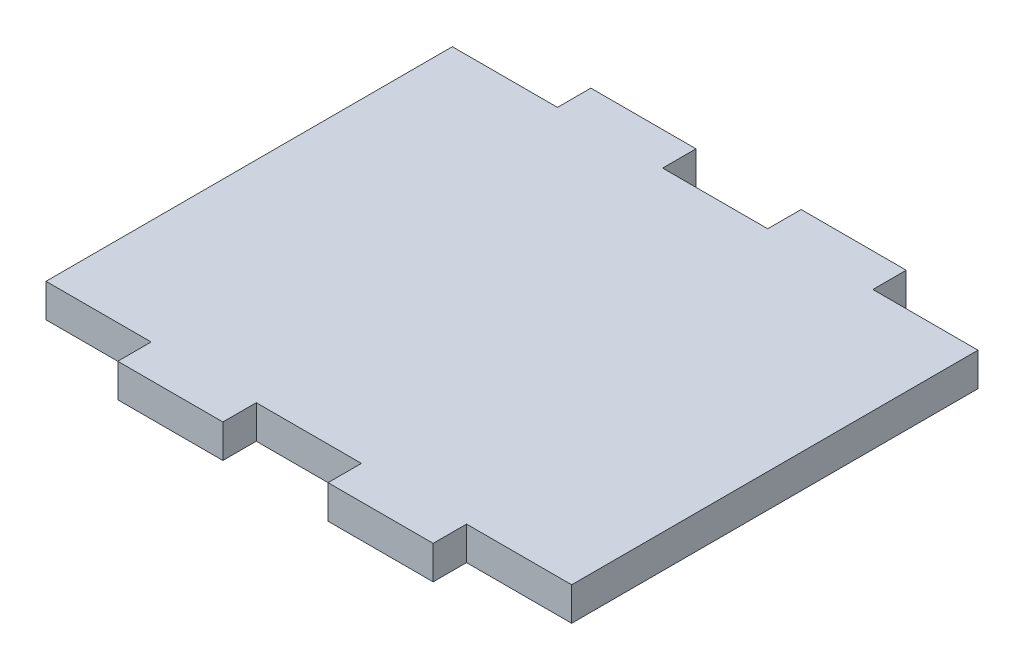
ISO-10303-21;
HEADER;
FILE_DESCRIPTION(('STEP AP214'),'2;1');
FILE_NAME('part.step','',(''),(''),'','','');
FILE_SCHEMA(('AUTOMOTIVE_DESIGN { 1 0 10303 214 1 1 1 1 }'));
ENDSEC;
DATA;
#1=APPLICATION_CONTEXT('core data for automotive mechanical design processes');
#2=APPLICATION_PROTOCOL_DEFINITION('international standard','automotive_design',2000,#1);
#3=PRODUCT_CONTEXT('',#1,'mechanical');
#4=PRODUCT('Part','Part','',(#3));
#5=PRODUCT_RELATED_PRODUCT_CATEGORY('part','',(#4));
#6=PRODUCT_DEFINITION_FORMATION('','',#4);
#7=PRODUCT_DEFINITION_CONTEXT('part definition',#1,'design');
#8=PRODUCT_DEFINITION('design','',#6,#7);
#9=PRODUCT_DEFINITION_SHAPE('','',#8);
#10=(LENGTH_UNIT() NAMED_UNIT(*) SI_UNIT(.MILLI.,.METRE.));
#11=(NAMED_UNIT(*) PLANE_ANGLE_UNIT() SI_UNIT($,.RADIAN.));
#12=(NAMED_UNIT(*) SI_UNIT($,.STERADIAN.) SOLID_ANGLE_UNIT());
#13=UNCERTAINTY_MEASURE_WITH_UNIT(LENGTH_MEASURE(1.E-05),#10,'distance_accuracy_value','');
#14=(GEOMETRIC_REPRESENTATION_CONTEXT(3) GLOBAL_UNCERTAINTY_ASSIGNED_CONTEXT((#13)) GLOBAL_UNIT_ASSIGNED_CONTEXT((#10,
#11,#12)) REPRESENTATION_CONTEXT('',''));
#15=CARTESIAN_POINT('',(0.,0.,0.));
#16=DIRECTION('',(0.,0.,1.));
#17=DIRECTION('',(1.,0.,0.));
#18=AXIS2_PLACEMENT_3D('',#15,#16,#17);
#19=CARTESIAN_POINT('',(10.,3.175,-45.));
#20=DIRECTION('',(1.,0.,0.));
#21=DIRECTION('',(0.,0.,-1.));
#22=AXIS2_PLACEMENT_3D('',#19,#20,#21);
#23=PLANE('',#22);
#24=DIRECTION('',(0.,0.,1.));
#25=VECTOR('',#24,1.);
#26=CARTESIAN_POINT('',(10.,0.,-45.));
#27=LINE('',#26,#25);
#28=CARTESIAN_POINT('',(10.,0.,-45.));
#29=VERTEX_POINT('',#28);
#30=CARTESIAN_POINT('',(10.,0.,-41.825));
#31=VERTEX_POINT('',#30);
#32=EDGE_CURVE('E201',#29,#31,#27,.T.);
#33=ORIENTED_EDGE('',*,*,#32,.T.);
#34=DIRECTION('',(0.,-1.,0.));
#35=VECTOR('',#34,1.);
#36=CARTESIAN_POINT('',(10.,3.175,-41.825));
#37=LINE('',#36,#35);
#38=CARTESIAN_POINT('',(10.,3.175,-41.825));
#39=VERTEX_POINT('',#38);
#40=EDGE_CURVE('E11',#39,#31,#37,.T.);
#41=ORIENTED_EDGE('',*,*,#40,.F.);
#42=DIRECTION('',(0.,0.,1.));
#43=VECTOR('',#42,1.);
#44=CARTESIAN_POINT('',(10.,3.175,-45.));
#45=LINE('',#44,#43);
#46=CARTESIAN_POINT('',(10.,3.175,-45.));
#47=VERTEX_POINT('',#46);
#48=EDGE_CURVE('E239',#47,#39,#45,.T.);
#49=ORIENTED_EDGE('',*,*,#48,.F.);
#50=DIRECTION('',(0.,-1.,0.));
#51=VECTOR('',#50,1.);
#52=CARTESIAN_POINT('',(10.,3.175,-45.));
#53=LINE('',#52,#51);
#54=EDGE_CURVE('E197',#47,#29,#53,.T.);
#55=ORIENTED_EDGE('',*,*,#54,.T.);
#56=EDGE_LOOP('',(#33,#41,#49,#55));
#57=FACE_BOUND('',#56,.T.);
#58=ADVANCED_FACE('F33',(#57),#23,.F.);
#59=CARTESIAN_POINT('',(0.,3.175,-41.825));
#60=DIRECTION('',(0.,0.,1.));
#61=DIRECTION('',(1.,0.,0.));
#62=AXIS2_PLACEMENT_3D('',#59,#60,#61);
#63=PLANE('',#62);
#64=DIRECTION('',(-1.,0.,0.));
#65=VECTOR('',#64,1.);
#66=CARTESIAN_POINT('',(0.,0.,-41.825));
#67=LINE('',#66,#65);
#68=CARTESIAN_POINT('',(0.,0.,-41.825));
#69=VERTEX_POINT('',#68);
#70=EDGE_CURVE('E204',#31,#69,#67,.T.);
#71=ORIENTED_EDGE('',*,*,#70,.T.);
#72=DIRECTION('',(0.,-1.,0.));
#73=VECTOR('',#72,1.);
#74=CARTESIAN_POINT('',(0.,3.175,-41.825));
#75=LINE('',#74,#73);
#76=CARTESIAN_POINT('',(0.,3.175,-41.825));
#77=VERTEX_POINT('',#76);
#78=EDGE_CURVE('E41',#77,#69,#75,.T.);
#79=ORIENTED_EDGE('',*,*,#78,.F.);
#80=DIRECTION('',(-1.,0.,0.));
#81=VECTOR('',#80,1.);
#82=CARTESIAN_POINT('',(0.,3.175,-41.825));
#83=LINE('',#82,#81);
#84=EDGE_CURVE('E128',#39,#77,#83,.T.);
#85=ORIENTED_EDGE('',*,*,#84,.F.);
#86=ORIENTED_EDGE('',*,*,#40,.T.);
#87=EDGE_LOOP('',(#71,#79,#85,#86));
#88=FACE_BOUND('',#87,.T.);
#89=ADVANCED_FACE('F357',(#88),#63,.F.);
#90=CARTESIAN_POINT('',(0.,3.175,-3.175));
#91=DIRECTION('',(1.,0.,0.));
#92=DIRECTION('',(0.,0.,-1.));
#93=AXIS2_PLACEMENT_3D('',#90,#91,#92);
#94=PLANE('',#93);
#95=DIRECTION('',(0.,0.,1.));
#96=VECTOR('',#95,1.);
#97=CARTESIAN_POINT('',(0.,0.,-3.175));
#98=LINE('',#97,#96);
#99=CARTESIAN_POINT('',(0.,0.,-3.175));
#100=VERTEX_POINT('',#99);
#101=EDGE_CURVE('E206',#69,#100,#98,.T.);
#102=ORIENTED_EDGE('',*,*,#101,.T.);
#103=DIRECTION('',(0.,-1.,0.));
#104=VECTOR('',#103,1.);
#105=CARTESIAN_POINT('',(0.,3.175,-3.175));
#106=LINE('',#105,#104);
#107=CARTESIAN_POINT('',(0.,3.175,-3.175));
#108=VERTEX_POINT('',#107);
#109=EDGE_CURVE('E282',#108,#100,#106,.T.);
#110=ORIENTED_EDGE('',*,*,#109,.F.);
#111=DIRECTION('',(0.,0.,1.));
#112=VECTOR('',#111,1.);
#113=CARTESIAN_POINT('',(0.,3.175,-3.175));
#114=LINE('',#113,#112);
#115=EDGE_CURVE('E290',#77,#108,#114,.T.);
#116=ORIENTED_EDGE('',*,*,#115,.F.);
#117=ORIENTED_EDGE('',*,*,#78,.T.);
#118=EDGE_LOOP('',(#102,#110,#116,#117));
#119=FACE_BOUND('',#118,.T.);
#120=ADVANCED_FACE('F288',(#119),#94,.F.);
#121=CARTESIAN_POINT('',(10.,3.175,-3.175));
#122=DIRECTION('',(0.,0.,-1.));
#123=DIRECTION('',(-1.,0.,0.));
#124=AXIS2_PLACEMENT_3D('',#121,#122,#123);
#125=PLANE('',#124);
#126=DIRECTION('',(1.,0.,0.));
#127=VECTOR('',#126,1.);
#128=CARTESIAN_POINT('',(10.,0.,-3.175));
#129=LINE('',#128,#127);
#130=CARTESIAN_POINT('',(10.,0.,-3.175));
#131=VERTEX_POINT('',#130);
#132=EDGE_CURVE('E208',#100,#131,#129,.T.);
#133=ORIENTED_EDGE('',*,*,#132,.T.);
#134=DIRECTION('',(0.,-1.,0.));
#135=VECTOR('',#134,1.);
#136=CARTESIAN_POINT('',(10.,3.175,-3.175));
#137=LINE('',#136,#135);
#138=CARTESIAN_POINT('',(10.,3.175,-3.175));
#139=VERTEX_POINT('',#138);
#140=EDGE_CURVE('E279',#139,#131,#137,.T.);
#141=ORIENTED_EDGE('',*,*,#140,.F.);
#142=DIRECTION('',(1.,0.,0.));
#143=VECTOR('',#142,1.);
#144=CARTESIAN_POINT('',(10.,3.175,-3.175));
#145=LINE('',#144,#143);
#146=EDGE_CURVE('E308',#108,#139,#145,.T.);
#147=ORIENTED_EDGE('',*,*,#146,.F.);
#148=ORIENTED_EDGE('',*,*,#109,.T.);
#149=EDGE_LOOP('',(#133,#141,#147,#148));
#150=FACE_BOUND('',#149,.T.);
#151=ADVANCED_FACE('F299',(#150),#125,.F.);
#152=CARTESIAN_POINT('',(10.,3.175,0.));
#153=DIRECTION('',(1.,0.,0.));
#154=DIRECTION('',(0.,0.,-1.));
#155=AXIS2_PLACEMENT_3D('',#152,#153,#154);
#156=PLANE('',#155);
#157=DIRECTION('',(0.,0.,1.));
#158=VECTOR('',#157,1.);
#159=CARTESIAN_POINT('',(10.,0.,0.));
#160=LINE('',#159,#158);
#161=CARTESIAN_POINT('',(10.,0.,0.));
#162=VERTEX_POINT('',#161);
#163=EDGE_CURVE('E210',#131,#162,#160,.T.);
#164=ORIENTED_EDGE('',*,*,#163,.T.);
#165=DIRECTION('',(0.,-1.,0.));
#166=VECTOR('',#165,1.);
#167=CARTESIAN_POINT('',(10.,3.175,0.));
#168=LINE('',#167,#166);
#169=CARTESIAN_POINT('',(10.,3.175,0.));
#170=VERTEX_POINT('',#169);
#171=EDGE_CURVE('E276',#170,#162,#168,.T.);
#172=ORIENTED_EDGE('',*,*,#171,.F.);
#173=DIRECTION('',(0.,0.,1.));
#174=VECTOR('',#173,1.);
#175=CARTESIAN_POINT('',(10.,3.175,0.));
#176=LINE('',#175,#174);
#177=EDGE_CURVE('E305',#139,#170,#176,.T.);
#178=ORIENTED_EDGE('',*,*,#177,.F.);
#179=ORIENTED_EDGE('',*,*,#140,.T.);
#180=EDGE_LOOP('',(#164,#172,#178,#179));
#181=FACE_BOUND('',#180,.T.);
#182=ADVANCED_FACE('F303',(#181),#156,.F.);
#183=CARTESIAN_POINT('',(10.,3.175,0.));
#184=DIRECTION('',(0.,0.,-1.));
#185=DIRECTION('',(-1.,0.,0.));
#186=AXIS2_PLACEMENT_3D('',#183,#184,#185);
#187=PLANE('',#186);
#188=DIRECTION('',(1.,0.,0.));
#189=VECTOR('',#188,1.);
#190=CARTESIAN_POINT('',(10.,0.,0.));
#191=LINE('',#190,#189);
#192=CARTESIAN_POINT('',(20.,0.,0.));
#193=VERTEX_POINT('',#192);
#194=EDGE_CURVE('E212',#162,#193,#191,.T.);
#195=ORIENTED_EDGE('',*,*,#194,.T.);
#196=DIRECTION('',(0.,-1.,0.));
#197=VECTOR('',#196,1.);
#198=CARTESIAN_POINT('',(20.,3.175,0.));
#199=LINE('',#198,#197);
#200=CARTESIAN_POINT('',(20.,3.175,0.));
#201=VERTEX_POINT('',#200);
#202=EDGE_CURVE('E273',#201,#193,#199,.T.);
#203=ORIENTED_EDGE('',*,*,#202,.F.);
#204=DIRECTION('',(1.,0.,0.));
#205=VECTOR('',#204,1.);
#206=CARTESIAN_POINT('',(10.,3.175,0.));
#207=LINE('',#206,#205);
#208=EDGE_CURVE('E307',#170,#201,#207,.T.);
#209=ORIENTED_EDGE('',*,*,#208,.F.);
#210=ORIENTED_EDGE('',*,*,#171,.T.);
#211=EDGE_LOOP('',(#195,#203,#209,#210));
#212=FACE_BOUND('',#211,.T.);
#213=ADVANCED_FACE('F370',(#212),#187,.F.);
#214=CARTESIAN_POINT('',(20.,3.175,0.));
#215=DIRECTION('',(-1.,0.,0.));
#216=DIRECTION('',(0.,0.,1.));
#217=AXIS2_PLACEMENT_3D('',#214,#215,#216);
#218=PLANE('',#217);
#219=DIRECTION('',(0.,0.,-1.));
#220=VECTOR('',#219,1.);
#221=CARTESIAN_POINT('',(20.,0.,0.));
#222=LINE('',#221,#220);
#223=CARTESIAN_POINT('',(20.,0.,-3.175));
#224=VERTEX_POINT('',#223);
#225=EDGE_CURVE('E214',#193,#224,#222,.T.);
#226=ORIENTED_EDGE('',*,*,#225,.T.);
#227=DIRECTION('',(0.,-1.,0.));
#228=VECTOR('',#227,1.);
#229=CARTESIAN_POINT('',(20.,3.175,-3.175));
#230=LINE('',#229,#228);
#231=CARTESIAN_POINT('',(20.,3.175,-3.175));
#232=VERTEX_POINT('',#231);
#233=EDGE_CURVE('E270',#232,#224,#230,.T.);
#234=ORIENTED_EDGE('',*,*,#233,.F.);
#235=DIRECTION('',(0.,0.,-1.));
#236=VECTOR('',#235,1.);
#237=CARTESIAN_POINT('',(20.,3.175,0.));
#238=LINE('',#237,#236);
#239=EDGE_CURVE('E310',#201,#232,#238,.T.);
#240=ORIENTED_EDGE('',*,*,#239,.F.);
#241=ORIENTED_EDGE('',*,*,#202,.T.);
#242=EDGE_LOOP('',(#226,#234,#240,#241));
#243=FACE_BOUND('',#242,.T.);
#244=ADVANCED_FACE('F373',(#243),#218,.F.);
#245=CARTESIAN_POINT('',(20.,3.175,-3.175));
#246=DIRECTION('',(0.,0.,-1.));
#247=DIRECTION('',(-1.,0.,0.));
#248=AXIS2_PLACEMENT_3D('',#245,#246,#247);
#249=PLANE('',#248);
#250=DIRECTION('',(1.,0.,0.));
#251=VECTOR('',#250,1.);
#252=CARTESIAN_POINT('',(20.,0.,-3.175));
#253=LINE('',#252,#251);
#254=CARTESIAN_POINT('',(30.,0.,-3.17500000000028));
#255=VERTEX_POINT('',#254);
#256=EDGE_CURVE('E216',#224,#255,#253,.T.);
#257=ORIENTED_EDGE('',*,*,#256,.T.);
#258=DIRECTION('',(0.,-1.,0.));
#259=VECTOR('',#258,1.);
#260=CARTESIAN_POINT('',(30.,3.175,-3.17500000000028));
#261=LINE('',#260,#259);
#262=CARTESIAN_POINT('',(30.,3.175,-3.17500000000028));
#263=VERTEX_POINT('',#262);
#264=EDGE_CURVE('E267',#263,#255,#261,.T.);
#265=ORIENTED_EDGE('',*,*,#264,.F.);
#266=DIRECTION('',(1.,0.,0.));
#267=VECTOR('',#266,1.);
#268=CARTESIAN_POINT('',(20.,3.175,-3.175));
#269=LINE('',#268,#267);
#270=EDGE_CURVE('E316',#232,#263,#269,.T.);
#271=ORIENTED_EDGE('',*,*,#270,.F.);
#272=ORIENTED_EDGE('',*,*,#233,.T.);
#273=EDGE_LOOP('',(#257,#265,#271,#272));
#274=FACE_BOUND('',#273,.T.);
#275=ADVANCED_FACE('F377',(#274),#249,.F.);
#276=CARTESIAN_POINT('',(30.,3.175,-2.79318507107451E-13));
#277=DIRECTION('',(1.,0.,0.));
#278=DIRECTION('',(0.,0.,-1.));
#279=AXIS2_PLACEMENT_3D('',#276,#277,#278);
#280=PLANE('',#279);
#281=DIRECTION('',(0.,0.,1.));
#282=VECTOR('',#281,1.);
#283=CARTESIAN_POINT('',(30.,0.,-2.79318507107451E-13));
#284=LINE('',#283,#282);
#285=CARTESIAN_POINT('',(30.,0.,-2.79318507107451E-13));
#286=VERTEX_POINT('',#285);
#287=EDGE_CURVE('E218',#255,#286,#284,.T.);
#288=ORIENTED_EDGE('',*,*,#287,.T.);
#289=DIRECTION('',(0.,-1.,0.));
#290=VECTOR('',#289,1.);
#291=CARTESIAN_POINT('',(30.,3.175,-2.79318507107451E-13));
#292=LINE('',#291,#290);
#293=CARTESIAN_POINT('',(30.,3.175,-2.79318507107451E-13));
#294=VERTEX_POINT('',#293);
#295=EDGE_CURVE('E264',#294,#286,#292,.T.);
#296=ORIENTED_EDGE('',*,*,#295,.F.);
#297=DIRECTION('',(0.,0.,1.));
#298=VECTOR('',#297,1.);
#299=CARTESIAN_POINT('',(30.,3.175,-2.79318507107451E-13));
#300=LINE('',#299,#298);
#301=EDGE_CURVE('E318',#263,#294,#300,.T.);
#302=ORIENTED_EDGE('',*,*,#301,.F.);
#303=ORIENTED_EDGE('',*,*,#264,.T.);
#304=EDGE_LOOP('',(#288,#296,#302,#303));
#305=FACE_BOUND('',#304,.T.);
#306=ADVANCED_FACE('F381',(#305),#280,.F.);
#307=CARTESIAN_POINT('',(30.,3.175,-2.79318507107451E-13));
#308=DIRECTION('',(0.,0.,-1.));
#309=DIRECTION('',(-1.,0.,0.));
#310=AXIS2_PLACEMENT_3D('',#307,#308,#309);
#311=PLANE('',#310);
#312=DIRECTION('',(1.,0.,0.));
#313=VECTOR('',#312,1.);
#314=CARTESIAN_POINT('',(30.,0.,-2.79318507107451E-13));
#315=LINE('',#314,#313);
#316=CARTESIAN_POINT('',(40.,0.,-2.65440719299636E-13));
#317=VERTEX_POINT('',#316);
#318=EDGE_CURVE('E220',#286,#317,#315,.T.);
#319=ORIENTED_EDGE('',*,*,#318,.T.);
#320=DIRECTION('',(0.,-1.,0.));
#321=VECTOR('',#320,1.);
#322=CARTESIAN_POINT('',(40.,3.175,-2.65440719299636E-13));
#323=LINE('',#322,#321);
#324=CARTESIAN_POINT('',(40.,3.175,-2.65440719299636E-13));
#325=VERTEX_POINT('',#324);
#326=EDGE_CURVE('E261',#325,#317,#323,.T.);
#327=ORIENTED_EDGE('',*,*,#326,.F.);
#328=DIRECTION('',(1.,0.,0.));
#329=VECTOR('',#328,1.);
#330=CARTESIAN_POINT('',(30.,3.175,-2.79318507107451E-13));
#331=LINE('',#330,#329);
#332=EDGE_CURVE('E320',#294,#325,#331,.T.);
#333=ORIENTED_EDGE('',*,*,#332,.F.);
#334=ORIENTED_EDGE('',*,*,#295,.T.);
#335=EDGE_LOOP('',(#319,#327,#333,#334));
#336=FACE_BOUND('',#335,.T.);
#337=ADVANCED_FACE('F385',(#336),#311,.F.);
#338=CARTESIAN_POINT('',(40.,3.175,-2.65440719299636E-13));
#339=DIRECTION('',(-1.,0.,0.));
#340=DIRECTION('',(0.,0.,1.));
#341=AXIS2_PLACEMENT_3D('',#338,#339,#340);
#342=PLANE('',#341);
#343=DIRECTION('',(0.,0.,-1.));
#344=VECTOR('',#343,1.);
#345=CARTESIAN_POINT('',(40.,0.,-2.65440719299636E-13));
#346=LINE('',#345,#344);
#347=CARTESIAN_POINT('',(40.,0.,-3.17500000000028));
#348=VERTEX_POINT('',#347);
#349=EDGE_CURVE('E222',#317,#348,#346,.T.);
#350=ORIENTED_EDGE('',*,*,#349,.T.);
#351=DIRECTION('',(0.,-1.,0.));
#352=VECTOR('',#351,1.);
#353=CARTESIAN_POINT('',(40.,3.175,-3.17500000000028));
#354=LINE('',#353,#352);
#355=CARTESIAN_POINT('',(40.,3.175,-3.17500000000028));
#356=VERTEX_POINT('',#355);
#357=EDGE_CURVE('E258',#356,#348,#354,.T.);
#358=ORIENTED_EDGE('',*,*,#357,.F.);
#359=DIRECTION('',(0.,0.,-1.));
#360=VECTOR('',#359,1.);
#361=CARTESIAN_POINT('',(40.,3.175,-2.65440719299636E-13));
#362=LINE('',#361,#360);
#363=EDGE_CURVE('E322',#325,#356,#362,.T.);
#364=ORIENTED_EDGE('',*,*,#363,.F.);
#365=ORIENTED_EDGE('',*,*,#326,.T.);
#366=EDGE_LOOP('',(#350,#358,#364,#365));
#367=FACE_BOUND('',#366,.T.);
#368=ADVANCED_FACE('F389',(#367),#342,.F.);
#369=CARTESIAN_POINT('',(40.,3.175,-3.17500000000028));
#370=DIRECTION('',(0.,0.,-1.));
#371=DIRECTION('',(-1.,0.,0.));
#372=AXIS2_PLACEMENT_3D('',#369,#370,#371);
#373=PLANE('',#372);
#374=DIRECTION('',(1.,0.,0.));
#375=VECTOR('',#374,1.);
#376=CARTESIAN_POINT('',(40.,0.,-3.17500000000028));
#377=LINE('',#376,#375);
#378=CARTESIAN_POINT('',(50.,0.,-3.175));
#379=VERTEX_POINT('',#378);
#380=EDGE_CURVE('E224',#348,#379,#377,.T.);
#381=ORIENTED_EDGE('',*,*,#380,.T.);
#382=DIRECTION('',(0.,-1.,0.));
#383=VECTOR('',#382,1.);
#384=CARTESIAN_POINT('',(50.,3.175,-3.175));
#385=LINE('',#384,#383);
#386=CARTESIAN_POINT('',(50.,3.175,-3.175));
#387=VERTEX_POINT('',#386);
#388=EDGE_CURVE('E255',#387,#379,#385,.T.);
#389=ORIENTED_EDGE('',*,*,#388,.F.);
#390=DIRECTION('',(1.,0.,0.));
#391=VECTOR('',#390,1.);
#392=CARTESIAN_POINT('',(40.,3.175,-3.17500000000028));
#393=LINE('',#392,#391);
#394=EDGE_CURVE('E324',#356,#387,#393,.T.);
#395=ORIENTED_EDGE('',*,*,#394,.F.);
#396=ORIENTED_EDGE('',*,*,#357,.T.);
#397=EDGE_LOOP('',(#381,#389,#395,#396));
#398=FACE_BOUND('',#397,.T.);
#399=ADVANCED_FACE('F393',(#398),#373,.F.);
#400=CARTESIAN_POINT('',(50.,3.175,-3.175));
#401=DIRECTION('',(-1.,0.,0.));
#402=DIRECTION('',(0.,0.,1.));
#403=AXIS2_PLACEMENT_3D('',#400,#401,#402);
#404=PLANE('',#403);
#405=DIRECTION('',(0.,0.,-1.));
#406=VECTOR('',#405,1.);
#407=CARTESIAN_POINT('',(50.,0.,-3.175));
#408=LINE('',#407,#406);
#409=CARTESIAN_POINT('',(50.,0.,-41.825));
#410=VERTEX_POINT('',#409);
#411=EDGE_CURVE('E226',#379,#410,#408,.T.);
#412=ORIENTED_EDGE('',*,*,#411,.T.);
#413=DIRECTION('',(0.,-1.,0.));
#414=VECTOR('',#413,1.);
#415=CARTESIAN_POINT('',(50.,3.175,-41.825));
#416=LINE('',#415,#414);
#417=CARTESIAN_POINT('',(50.,3.175,-41.825));
#418=VERTEX_POINT('',#417);
#419=EDGE_CURVE('E252',#418,#410,#416,.T.);
#420=ORIENTED_EDGE('',*,*,#419,.F.);
#421=DIRECTION('',(0.,0.,-1.));
#422=VECTOR('',#421,1.);
#423=CARTESIAN_POINT('',(50.,3.175,-3.175));
#424=LINE('',#423,#422);
#425=EDGE_CURVE('E326',#387,#418,#424,.T.);
#426=ORIENTED_EDGE('',*,*,#425,.F.);
#427=ORIENTED_EDGE('',*,*,#388,.T.);
#428=EDGE_LOOP('',(#412,#420,#426,#427));
#429=FACE_BOUND('',#428,.T.);
#430=ADVANCED_FACE('F397',(#429),#404,.F.);
#431=CARTESIAN_POINT('',(40.,3.175,-41.8250000000003));
#432=DIRECTION('',(0.,0.,1.));
#433=DIRECTION('',(1.,0.,0.));
#434=AXIS2_PLACEMENT_3D('',#431,#432,#433);
#435=PLANE('',#434);
#436=DIRECTION('',(-1.,0.,0.));
#437=VECTOR('',#436,1.);
#438=CARTESIAN_POINT('',(40.,0.,-41.8250000000003));
#439=LINE('',#438,#437);
#440=CARTESIAN_POINT('',(40.,0.,-41.8250000000003));
#441=VERTEX_POINT('',#440);
#442=EDGE_CURVE('E228',#410,#441,#439,.T.);
#443=ORIENTED_EDGE('',*,*,#442,.T.);
#444=DIRECTION('',(0.,-1.,0.));
#445=VECTOR('',#444,1.);
#446=CARTESIAN_POINT('',(40.,3.175,-41.8250000000003));
#447=LINE('',#446,#445);
#448=CARTESIAN_POINT('',(40.,3.175,-41.8250000000003));
#449=VERTEX_POINT('',#448);
#450=EDGE_CURVE('E249',#449,#441,#447,.T.);
#451=ORIENTED_EDGE('',*,*,#450,.F.);
#452=DIRECTION('',(-1.,0.,0.));
#453=VECTOR('',#452,1.);
#454=CARTESIAN_POINT('',(40.,3.175,-41.8250000000003));
#455=LINE('',#454,#453);
#456=EDGE_CURVE('E328',#418,#449,#455,.T.);
#457=ORIENTED_EDGE('',*,*,#456,.F.);
#458=ORIENTED_EDGE('',*,*,#419,.T.);
#459=EDGE_LOOP('',(#443,#451,#457,#458));
#460=FACE_BOUND('',#459,.T.);
#461=ADVANCED_FACE('F401',(#460),#435,.F.);
#462=CARTESIAN_POINT('',(40.,3.175,-45.0000000000003));
#463=DIRECTION('',(-1.,0.,0.));
#464=DIRECTION('',(0.,0.,1.));
#465=AXIS2_PLACEMENT_3D('',#462,#463,#464);
#466=PLANE('',#465);
#467=DIRECTION('',(0.,0.,-1.));
#468=VECTOR('',#467,1.);
#469=CARTESIAN_POINT('',(40.,0.,-45.0000000000003));
#470=LINE('',#469,#468);
#471=CARTESIAN_POINT('',(40.,0.,-45.0000000000003));
#472=VERTEX_POINT('',#471);
#473=EDGE_CURVE('E230',#441,#472,#470,.T.);
#474=ORIENTED_EDGE('',*,*,#473,.T.);
#475=DIRECTION('',(0.,-1.,0.));
#476=VECTOR('',#475,1.);
#477=CARTESIAN_POINT('',(40.,3.175,-45.0000000000003));
#478=LINE('',#477,#476);
#479=CARTESIAN_POINT('',(40.,3.175,-45.0000000000003));
#480=VERTEX_POINT('',#479);
#481=EDGE_CURVE('E246',#480,#472,#478,.T.);
#482=ORIENTED_EDGE('',*,*,#481,.F.);
#483=DIRECTION('',(0.,0.,-1.));
#484=VECTOR('',#483,1.);
#485=CARTESIAN_POINT('',(40.,3.175,-45.0000000000003));
#486=LINE('',#485,#484);
#487=EDGE_CURVE('E330',#449,#480,#486,.T.);
#488=ORIENTED_EDGE('',*,*,#487,.F.);
#489=ORIENTED_EDGE('',*,*,#450,.T.);
#490=EDGE_LOOP('',(#474,#482,#488,#489));
#491=FACE_BOUND('',#490,.T.);
#492=ADVANCED_FACE('F405',(#491),#466,.F.);
#493=CARTESIAN_POINT('',(30.,3.175,-44.9999999999997));
#494=DIRECTION('',(0.,0.,1.));
#495=DIRECTION('',(1.,0.,0.));
#496=AXIS2_PLACEMENT_3D('',#493,#494,#495);
#497=PLANE('',#496);
#498=DIRECTION('',(-1.,0.,0.));
#499=VECTOR('',#498,1.);
#500=CARTESIAN_POINT('',(30.,0.,-44.9999999999997));
#501=LINE('',#500,#499);
#502=CARTESIAN_POINT('',(30.,0.,-44.9999999999997));
#503=VERTEX_POINT('',#502);
#504=EDGE_CURVE('E232',#472,#503,#501,.T.);
#505=ORIENTED_EDGE('',*,*,#504,.T.);
#506=DIRECTION('',(0.,-1.,0.));
#507=VECTOR('',#506,1.);
#508=CARTESIAN_POINT('',(30.,3.175,-44.9999999999997));
#509=LINE('',#508,#507);
#510=CARTESIAN_POINT('',(30.,3.175,-44.9999999999997));
#511=VERTEX_POINT('',#510);
#512=EDGE_CURVE('E243',#511,#503,#509,.T.);
#513=ORIENTED_EDGE('',*,*,#512,.F.);
#514=DIRECTION('',(-1.,0.,0.));
#515=VECTOR('',#514,1.);
#516=CARTESIAN_POINT('',(30.,3.175,-44.9999999999997));
#517=LINE('',#516,#515);
#518=EDGE_CURVE('E332',#480,#511,#517,.T.);
#519=ORIENTED_EDGE('',*,*,#518,.F.);
#520=ORIENTED_EDGE('',*,*,#481,.T.);
#521=EDGE_LOOP('',(#505,#513,#519,#520));
#522=FACE_BOUND('',#521,.T.);
#523=ADVANCED_FACE('F338',(#522),#497,.F.);
#524=CARTESIAN_POINT('',(30.,3.175,-44.9999999999997));
#525=DIRECTION('',(1.,0.,0.));
#526=DIRECTION('',(0.,0.,-1.));
#527=AXIS2_PLACEMENT_3D('',#524,#525,#526);
#528=PLANE('',#527);
#529=DIRECTION('',(0.,0.,1.));
#530=VECTOR('',#529,1.);
#531=CARTESIAN_POINT('',(30.,0.,-44.9999999999997));
#532=LINE('',#531,#530);
#533=CARTESIAN_POINT('',(30.,0.,-41.8249999999997));
#534=VERTEX_POINT('',#533);
#535=EDGE_CURVE('E234',#503,#534,#532,.T.);
#536=ORIENTED_EDGE('',*,*,#535,.T.);
#537=DIRECTION('',(0.,-1.,0.));
#538=VECTOR('',#537,1.);
#539=CARTESIAN_POINT('',(30.,3.175,-41.8249999999997));
#540=LINE('',#539,#538);
#541=CARTESIAN_POINT('',(30.,3.175,-41.8249999999997));
#542=VERTEX_POINT('',#541);
#543=EDGE_CURVE('E192',#542,#534,#540,.T.);
#544=ORIENTED_EDGE('',*,*,#543,.F.);
#545=DIRECTION('',(0.,0.,1.));
#546=VECTOR('',#545,1.);
#547=CARTESIAN_POINT('',(30.,3.175,-44.9999999999997));
#548=LINE('',#547,#546);
#549=EDGE_CURVE('E183',#511,#542,#548,.T.);
#550=ORIENTED_EDGE('',*,*,#549,.F.);
#551=ORIENTED_EDGE('',*,*,#512,.T.);
#552=EDGE_LOOP('',(#536,#544,#550,#551));
#553=FACE_BOUND('',#552,.T.);
#554=ADVANCED_FACE('F342',(#553),#528,.F.);
#555=CARTESIAN_POINT('',(20.,3.175,-41.825));
#556=DIRECTION('',(0.,0.,1.));
#557=DIRECTION('',(1.,0.,0.));
#558=AXIS2_PLACEMENT_3D('',#555,#556,#557);
#559=PLANE('',#558);
#560=DIRECTION('',(-1.,0.,0.));
#561=VECTOR('',#560,1.);
#562=CARTESIAN_POINT('',(20.,0.,-41.825));
#563=LINE('',#562,#561);
#564=CARTESIAN_POINT('',(20.,0.,-41.825));
#565=VERTEX_POINT('',#564);
#566=EDGE_CURVE('E191',#534,#565,#563,.T.);
#567=ORIENTED_EDGE('',*,*,#566,.T.);
#568=DIRECTION('',(0.,-1.,0.));
#569=VECTOR('',#568,1.);
#570=CARTESIAN_POINT('',(20.,3.175,-41.825));
#571=LINE('',#570,#569);
#572=CARTESIAN_POINT('',(20.,3.175,-41.825));
#573=VERTEX_POINT('',#572);
#574=EDGE_CURVE('E188',#573,#565,#571,.T.);
#575=ORIENTED_EDGE('',*,*,#574,.F.);
#576=DIRECTION('',(-1.,0.,0.));
#577=VECTOR('',#576,1.);
#578=CARTESIAN_POINT('',(20.,3.175,-41.825));
#579=LINE('',#578,#577);
#580=EDGE_CURVE('E177',#542,#573,#579,.T.);
#581=ORIENTED_EDGE('',*,*,#580,.F.);
#582=ORIENTED_EDGE('',*,*,#543,.T.);
#583=EDGE_LOOP('',(#567,#575,#581,#582));
#584=FACE_BOUND('',#583,.T.);
#585=ADVANCED_FACE('F189',(#584),#559,.F.);
#586=CARTESIAN_POINT('',(20.,3.175,-45.));
#587=DIRECTION('',(-1.,0.,0.));
#588=DIRECTION('',(0.,0.,1.));
#589=AXIS2_PLACEMENT_3D('',#586,#587,#588);
#590=PLANE('',#589);
#591=DIRECTION('',(0.,0.,-1.));
#592=VECTOR('',#591,1.);
#593=CARTESIAN_POINT('',(20.,0.,-45.));
#594=LINE('',#593,#592);
#595=CARTESIAN_POINT('',(20.,0.,-45.));
#596=VERTEX_POINT('',#595);
#597=EDGE_CURVE('E114',#565,#596,#594,.T.);
#598=ORIENTED_EDGE('',*,*,#597,.T.);
#599=DIRECTION('',(0.,-1.,0.));
#600=VECTOR('',#599,1.);
#601=CARTESIAN_POINT('',(20.,3.175,-45.));
#602=LINE('',#601,#600);
#603=CARTESIAN_POINT('',(20.,3.175,-45.));
#604=VERTEX_POINT('',#603);
#605=EDGE_CURVE('E193',#604,#596,#602,.T.);
#606=ORIENTED_EDGE('',*,*,#605,.F.);
#607=DIRECTION('',(0.,0.,-1.));
#608=VECTOR('',#607,1.);
#609=CARTESIAN_POINT('',(20.,3.175,-45.));
#610=LINE('',#609,#608);
#611=EDGE_CURVE('E181',#573,#604,#610,.T.);
#612=ORIENTED_EDGE('',*,*,#611,.F.);
#613=ORIENTED_EDGE('',*,*,#574,.T.);
#614=EDGE_LOOP('',(#598,#606,#612,#613));
#615=FACE_BOUND('',#614,.T.);
#616=ADVANCED_FACE('F195',(#615),#590,.F.);
#617=CARTESIAN_POINT('',(10.,3.175,-45.));
#618=DIRECTION('',(0.,0.,1.));
#619=DIRECTION('',(1.,0.,0.));
#620=AXIS2_PLACEMENT_3D('',#617,#618,#619);
#621=PLANE('',#620);
#622=DIRECTION('',(-1.,0.,0.));
#623=VECTOR('',#622,1.);
#624=CARTESIAN_POINT('',(10.,0.,-45.));
#625=LINE('',#624,#623);
#626=EDGE_CURVE('E120',#596,#29,#625,.T.);
#627=ORIENTED_EDGE('',*,*,#626,.T.);
#628=ORIENTED_EDGE('',*,*,#54,.F.);
#629=DIRECTION('',(-1.,0.,0.));
#630=VECTOR('',#629,1.);
#631=CARTESIAN_POINT('',(10.,3.175,-45.));
#632=LINE('',#631,#630);
#633=EDGE_CURVE('E49',#604,#47,#632,.T.);
#634=ORIENTED_EDGE('',*,*,#633,.F.);
#635=ORIENTED_EDGE('',*,*,#605,.T.);
#636=EDGE_LOOP('',(#627,#628,#634,#635));
#637=FACE_BOUND('',#636,.T.);
#638=ADVANCED_FACE('F346',(#637),#621,.F.);
#639=CARTESIAN_POINT('',(0.,3.175,0.));
#640=DIRECTION('',(0.,1.,0.));
#641=DIRECTION('',(0.,0.,1.));
#642=AXIS2_PLACEMENT_3D('',#639,#640,#641);
#643=PLANE('',#642);
#644=ORIENTED_EDGE('',*,*,#48,.T.);
#645=ORIENTED_EDGE('',*,*,#84,.T.);
#646=ORIENTED_EDGE('',*,*,#115,.T.);
#647=ORIENTED_EDGE('',*,*,#146,.T.);
#648=ORIENTED_EDGE('',*,*,#177,.T.);
#649=ORIENTED_EDGE('',*,*,#208,.T.);
#650=ORIENTED_EDGE('',*,*,#239,.T.);
#651=ORIENTED_EDGE('',*,*,#270,.T.);
#652=ORIENTED_EDGE('',*,*,#301,.T.);
#653=ORIENTED_EDGE('',*,*,#332,.T.);
#654=ORIENTED_EDGE('',*,*,#363,.T.);
#655=ORIENTED_EDGE('',*,*,#394,.T.);
#656=ORIENTED_EDGE('',*,*,#425,.T.);
#657=ORIENTED_EDGE('',*,*,#456,.T.);
#658=ORIENTED_EDGE('',*,*,#487,.T.);
#659=ORIENTED_EDGE('',*,*,#518,.T.);
#660=ORIENTED_EDGE('',*,*,#549,.T.);
#661=ORIENTED_EDGE('',*,*,#580,.T.);
#662=ORIENTED_EDGE('',*,*,#611,.T.);
#663=ORIENTED_EDGE('',*,*,#633,.T.);
#664=EDGE_LOOP('',(#644,#645,#646,#647,#648,#649,#650,#651,#652,#653,#654,#655,#656,#657,#658,
#659,#660,#661,#662,#663));
#665=FACE_BOUND('',#664,.T.);
#666=ADVANCED_FACE('F179',(#665),#643,.T.);
#667=CARTESIAN_POINT('',(0.,0.,0.));
#668=DIRECTION('',(0.,1.,0.));
#669=DIRECTION('',(0.,0.,1.));
#670=AXIS2_PLACEMENT_3D('',#667,#668,#669);
#671=PLANE('',#670);
#672=ORIENTED_EDGE('',*,*,#32,.F.);
#673=ORIENTED_EDGE('',*,*,#626,.F.);
#674=ORIENTED_EDGE('',*,*,#597,.F.);
#675=ORIENTED_EDGE('',*,*,#566,.F.);
#676=ORIENTED_EDGE('',*,*,#535,.F.);
#677=ORIENTED_EDGE('',*,*,#504,.F.);
#678=ORIENTED_EDGE('',*,*,#473,.F.);
#679=ORIENTED_EDGE('',*,*,#442,.F.);
#680=ORIENTED_EDGE('',*,*,#411,.F.);
#681=ORIENTED_EDGE('',*,*,#380,.F.);
#682=ORIENTED_EDGE('',*,*,#349,.F.);
#683=ORIENTED_EDGE('',*,*,#318,.F.);
#684=ORIENTED_EDGE('',*,*,#287,.F.);
#685=ORIENTED_EDGE('',*,*,#256,.F.);
#686=ORIENTED_EDGE('',*,*,#225,.F.);
#687=ORIENTED_EDGE('',*,*,#194,.F.);
#688=ORIENTED_EDGE('',*,*,#163,.F.);
#689=ORIENTED_EDGE('',*,*,#132,.F.);
#690=ORIENTED_EDGE('',*,*,#101,.F.);
#691=ORIENTED_EDGE('',*,*,#70,.F.);
#692=EDGE_LOOP('',(#672,#673,#674,#675,#676,#677,#678,#679,#680,#681,#682,#683,#684,#685,#686,
#687,#688,#689,#690,#691));
#693=FACE_BOUND('',#692,.T.);
#694=ADVANCED_FACE('F294',(#693),#671,.F.);
#695=CLOSED_SHELL('',(#58,#89,#120,#151,#182,#213,#244,#275,#306,#337,#368,#399,#430,#461,#492,
#523,#554,#585,#616,#638,#666,#694));
#696=MANIFOLD_SOLID_BREP('B2',#695);
#697=ADVANCED_BREP_SHAPE_REPRESENTATION('',(#18,#696),#14);
#698=SHAPE_DEFINITION_REPRESENTATION(#9,#697);
ENDSEC;
END-ISO-10303-21;
